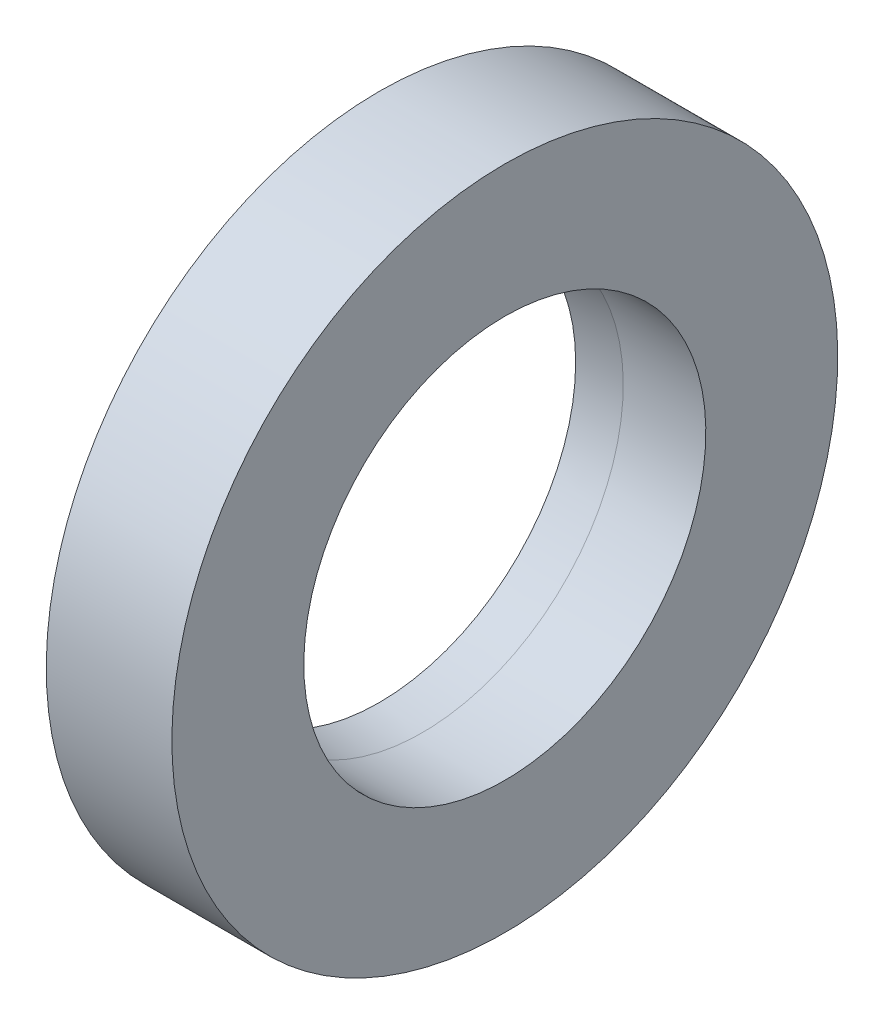
ISO-10303-21;
HEADER;
FILE_DESCRIPTION(('STEP AP214'),'2;1');
FILE_NAME('part.step','',(''),(''),'','','');
FILE_SCHEMA(('AUTOMOTIVE_DESIGN { 1 0 10303 214 1 1 1 1 }'));
ENDSEC;
DATA;
#1=APPLICATION_CONTEXT('core data for automotive mechanical design processes');
#2=APPLICATION_PROTOCOL_DEFINITION('international standard','automotive_design',2000,#1);
#3=PRODUCT_CONTEXT('',#1,'mechanical');
#4=PRODUCT('Part','Part','',(#3));
#5=PRODUCT_RELATED_PRODUCT_CATEGORY('part','',(#4));
#6=PRODUCT_DEFINITION_FORMATION('','',#4);
#7=PRODUCT_DEFINITION_CONTEXT('part definition',#1,'design');
#8=PRODUCT_DEFINITION('design','',#6,#7);
#9=PRODUCT_DEFINITION_SHAPE('','',#8);
#10=(LENGTH_UNIT() NAMED_UNIT(*) SI_UNIT(.MILLI.,.METRE.));
#11=(NAMED_UNIT(*) PLANE_ANGLE_UNIT() SI_UNIT($,.RADIAN.));
#12=(NAMED_UNIT(*) SI_UNIT($,.STERADIAN.) SOLID_ANGLE_UNIT());
#13=UNCERTAINTY_MEASURE_WITH_UNIT(LENGTH_MEASURE(1.E-05),#10,'distance_accuracy_value','');
#14=(GEOMETRIC_REPRESENTATION_CONTEXT(3) GLOBAL_UNCERTAINTY_ASSIGNED_CONTEXT((#13)) GLOBAL_UNIT_ASSIGNED_CONTEXT((#10,
#11,#12)) REPRESENTATION_CONTEXT('',''));
#15=CARTESIAN_POINT('',(0.,0.,0.));
#16=DIRECTION('',(0.,0.,1.));
#17=DIRECTION('',(1.,0.,0.));
#18=AXIS2_PLACEMENT_3D('',#15,#16,#17);
#19=CARTESIAN_POINT('',(17.7364104268147,24.7703748859759,0.));
#20=DIRECTION('',(-1.,0.,0.));
#21=DIRECTION('',(0.,-1.,0.));
#22=AXIS2_PLACEMENT_3D('',#19,#20,#21);
#23=PLANE('',#22);
#24=CARTESIAN_POINT('',(17.7364104268147,0.,0.));
#25=DIRECTION('',(1.,0.,0.));
#26=DIRECTION('',(0.,1.,0.));
#27=AXIS2_PLACEMENT_3D('',#24,#25,#26);
#28=CIRCLE('',#27,24.7703748859759);
#29=CARTESIAN_POINT('',(17.7364104268147,24.7703748859759,0.));
#30=VERTEX_POINT('',#29);
#31=EDGE_CURVE('E68',#30,#30,#28,.T.);
#32=ORIENTED_EDGE('',*,*,#31,.T.);
#33=EDGE_LOOP('',(#32));
#34=FACE_BOUND('',#33,.T.);
#35=CARTESIAN_POINT('',(17.7364104268147,0.,0.));
#36=DIRECTION('',(1.,0.,0.));
#37=DIRECTION('',(0.,1.,0.));
#38=AXIS2_PLACEMENT_3D('',#35,#36,#37);
#39=CIRCLE('',#38,26.5);
#40=CARTESIAN_POINT('',(17.7364104268147,26.5,0.));
#41=VERTEX_POINT('',#40);
#42=EDGE_CURVE('E10',#41,#41,#39,.T.);
#43=ORIENTED_EDGE('',*,*,#42,.F.);
#44=EDGE_LOOP('',(#43));
#45=FACE_BOUND('',#44,.T.);
#46=ADVANCED_FACE('F31',(#34,#45),#23,.T.);
#47=CARTESIAN_POINT('',(54.7364104268147,0.,0.));
#48=DIRECTION('',(1.,0.,0.));
#49=DIRECTION('',(0.,1.,0.));
#50=AXIS2_PLACEMENT_3D('',#47,#48,#49);
#51=CYLINDRICAL_SURFACE('',#50,26.5);
#52=ORIENTED_EDGE('',*,*,#42,.T.);
#53=EDGE_LOOP('',(#52));
#54=FACE_BOUND('',#53,.T.);
#55=CARTESIAN_POINT('',(27.7364104268147,0.,0.));
#56=DIRECTION('',(1.,0.,0.));
#57=DIRECTION('',(0.,1.,0.));
#58=AXIS2_PLACEMENT_3D('',#55,#56,#57);
#59=CIRCLE('',#58,26.5);
#60=CARTESIAN_POINT('',(27.7364104268147,26.5,0.));
#61=VERTEX_POINT('',#60);
#62=EDGE_CURVE('E37',#61,#61,#59,.T.);
#63=ORIENTED_EDGE('',*,*,#62,.F.);
#64=EDGE_LOOP('',(#63));
#65=FACE_BOUND('',#64,.T.);
#66=ADVANCED_FACE('F86',(#54,#65),#51,.T.);
#67=CARTESIAN_POINT('',(27.7364104268147,26.5,0.));
#68=DIRECTION('',(1.,0.,0.));
#69=DIRECTION('',(0.,1.,0.));
#70=AXIS2_PLACEMENT_3D('',#67,#68,#69);
#71=PLANE('',#70);
#72=ORIENTED_EDGE('',*,*,#62,.T.);
#73=EDGE_LOOP('',(#72));
#74=FACE_BOUND('',#73,.T.);
#75=CARTESIAN_POINT('',(27.7364104268147,0.,0.));
#76=DIRECTION('',(1.,0.,0.));
#77=DIRECTION('',(0.,1.,0.));
#78=AXIS2_PLACEMENT_3D('',#75,#76,#77);
#79=CIRCLE('',#78,16.);
#80=CARTESIAN_POINT('',(27.7364104268147,16.,0.));
#81=VERTEX_POINT('',#80);
#82=EDGE_CURVE('E41',#81,#81,#79,.T.);
#83=ORIENTED_EDGE('',*,*,#82,.F.);
#84=EDGE_LOOP('',(#83));
#85=FACE_BOUND('',#84,.T.);
#86=ADVANCED_FACE('F90',(#74,#85),#71,.T.);
#87=CARTESIAN_POINT('',(54.7364104268147,0.,0.));
#88=DIRECTION('',(1.,0.,0.));
#89=DIRECTION('',(0.,1.,0.));
#90=AXIS2_PLACEMENT_3D('',#87,#88,#89);
#91=CYLINDRICAL_SURFACE('',#90,16.);
#92=ORIENTED_EDGE('',*,*,#82,.T.);
#93=EDGE_LOOP('',(#92));
#94=FACE_BOUND('',#93,.T.);
#95=CARTESIAN_POINT('',(21.1639889777772,0.,0.));
#96=DIRECTION('',(1.,0.,0.));
#97=DIRECTION('',(0.,1.,0.));
#98=AXIS2_PLACEMENT_3D('',#95,#96,#97);
#99=CIRCLE('',#98,16.);
#100=CARTESIAN_POINT('',(21.1639889777772,16.,0.));
#101=VERTEX_POINT('',#100);
#102=EDGE_CURVE('E45',#101,#101,#99,.T.);
#103=ORIENTED_EDGE('',*,*,#102,.F.);
#104=EDGE_LOOP('',(#103));
#105=FACE_BOUND('',#104,.T.);
#106=ADVANCED_FACE('F94',(#94,#105),#91,.F.);
#107=CARTESIAN_POINT('',(17.7364104268147,0.,0.));
#108=DIRECTION('',(1.,0.,0.));
#109=DIRECTION('',(0.,1.,0.));
#110=AXIS2_PLACEMENT_3D('',#107,#108,#109);
#111=CONICAL_SURFACE('',#110,15.6393754424012,0.104826965376568);
#112=ORIENTED_EDGE('',*,*,#102,.T.);
#113=EDGE_LOOP('',(#112));
#114=FACE_BOUND('',#113,.T.);
#115=CARTESIAN_POINT('',(17.7364104268147,0.,0.));
#116=DIRECTION('',(1.,0.,0.));
#117=DIRECTION('',(0.,1.,0.));
#118=AXIS2_PLACEMENT_3D('',#115,#116,#117);
#119=CIRCLE('',#118,15.6393754424012);
#120=CARTESIAN_POINT('',(17.7364104268147,15.6393754424012,0.));
#121=VERTEX_POINT('',#120);
#122=EDGE_CURVE('E50',#121,#121,#119,.T.);
#123=ORIENTED_EDGE('',*,*,#122,.F.);
#124=EDGE_LOOP('',(#123));
#125=FACE_BOUND('',#124,.T.);
#126=ADVANCED_FACE('F100',(#114,#125),#111,.F.);
#127=CARTESIAN_POINT('',(17.7364104268147,15.6393754424012,0.));
#128=DIRECTION('',(-1.,0.,0.));
#129=DIRECTION('',(0.,-1.,0.));
#130=AXIS2_PLACEMENT_3D('',#127,#128,#129);
#131=PLANE('',#130);
#132=ORIENTED_EDGE('',*,*,#122,.T.);
#133=EDGE_LOOP('',(#132));
#134=FACE_BOUND('',#133,.T.);
#135=CARTESIAN_POINT('',(17.7364104268147,0.,0.));
#136=DIRECTION('',(1.,0.,0.));
#137=DIRECTION('',(0.,1.,0.));
#138=AXIS2_PLACEMENT_3D('',#135,#136,#137);
#139=CIRCLE('',#138,17.3108369693572);
#140=CARTESIAN_POINT('',(17.7364104268147,17.3108369693572,0.));
#141=VERTEX_POINT('',#140);
#142=EDGE_CURVE('E53',#141,#141,#139,.T.);
#143=ORIENTED_EDGE('',*,*,#142,.F.);
#144=EDGE_LOOP('',(#143));
#145=FACE_BOUND('',#144,.T.);
#146=ADVANCED_FACE('F104',(#134,#145),#131,.T.);
#147=CARTESIAN_POINT('',(21.9814029852584,0.,0.));
#148=DIRECTION('',(1.,0.,0.));
#149=DIRECTION('',(0.,1.,0.));
#150=AXIS2_PLACEMENT_3D('',#147,#148,#149);
#151=CONICAL_SURFACE('',#150,19.9863118096092,0.562377203469245);
#152=ORIENTED_EDGE('',*,*,#142,.T.);
#153=EDGE_LOOP('',(#152));
#154=FACE_BOUND('',#153,.T.);
#155=CARTESIAN_POINT('',(21.9814029852584,0.,0.));
#156=DIRECTION('',(1.,0.,0.));
#157=DIRECTION('',(0.,1.,0.));
#158=AXIS2_PLACEMENT_3D('',#155,#156,#157);
#159=CIRCLE('',#158,19.9863118096092);
#160=CARTESIAN_POINT('',(21.9814029852584,19.9863118096092,0.));
#161=VERTEX_POINT('',#160);
#162=EDGE_CURVE('E56',#161,#161,#159,.T.);
#163=ORIENTED_EDGE('',*,*,#162,.F.);
#164=EDGE_LOOP('',(#163));
#165=FACE_BOUND('',#164,.T.);
#166=ADVANCED_FACE('F108',(#154,#165),#151,.T.);
#167=CARTESIAN_POINT('',(21.1816047958759,0.,0.));
#168=DIRECTION('',(1.,0.,0.));
#169=DIRECTION('',(0.,1.,0.));
#170=AXIS2_PLACEMENT_3D('',#167,#168,#169);
#171=TOROIDAL_SURFACE('',#170,21.2552967804661,1.5);
#172=ORIENTED_EDGE('',*,*,#162,.T.);
#173=EDGE_LOOP('',(#172));
#174=FACE_BOUND('',#173,.T.);
#175=CARTESIAN_POINT('',(21.9861901338402,0.,0.));
#176=DIRECTION('',(1.,0.,0.));
#177=DIRECTION('',(0.,1.,0.));
#178=AXIS2_PLACEMENT_3D('',#175,#176,#177);
#179=CIRCLE('',#178,22.5212519273543);
#180=CARTESIAN_POINT('',(21.9861901338402,22.5212519273543,0.));
#181=VERTEX_POINT('',#180);
#182=EDGE_CURVE('E59',#181,#181,#179,.T.);
#183=ORIENTED_EDGE('',*,*,#182,.F.);
#184=EDGE_LOOP('',(#183));
#185=FACE_BOUND('',#184,.T.);
#186=ADVANCED_FACE('F112',(#174,#185),#171,.F.);
#187=CARTESIAN_POINT('',(19.4501997022959,0.,0.));
#188=DIRECTION('',(-1.,0.,0.));
#189=DIRECTION('',(0.,-1.,0.));
#190=AXIS2_PLACEMENT_3D('',#187,#188,#189);
#191=CONICAL_SURFACE('',#190,24.1330157591563,0.566154131261302);
#192=ORIENTED_EDGE('',*,*,#182,.T.);
#193=EDGE_LOOP('',(#192));
#194=FACE_BOUND('',#193,.T.);
#195=CARTESIAN_POINT('',(19.4501997022959,0.,0.));
#196=DIRECTION('',(1.,0.,0.));
#197=DIRECTION('',(0.,1.,0.));
#198=AXIS2_PLACEMENT_3D('',#195,#196,#197);
#199=CIRCLE('',#198,24.1330157591563);
#200=CARTESIAN_POINT('',(19.4501997022959,24.1330157591563,0.));
#201=VERTEX_POINT('',#200);
#202=EDGE_CURVE('E62',#201,#201,#199,.T.);
#203=ORIENTED_EDGE('',*,*,#202,.F.);
#204=EDGE_LOOP('',(#203));
#205=FACE_BOUND('',#204,.T.);
#206=ADVANCED_FACE('F82',(#194,#205),#191,.F.);
#207=CARTESIAN_POINT('',(19.4501997022959,24.1330157591563,0.));
#208=DIRECTION('',(-1.,0.,0.));
#209=DIRECTION('',(0.,-1.,0.));
#210=AXIS2_PLACEMENT_3D('',#207,#208,#209);
#211=PLANE('',#210);
#212=ORIENTED_EDGE('',*,*,#202,.T.);
#213=EDGE_LOOP('',(#212));
#214=FACE_BOUND('',#213,.T.);
#215=CARTESIAN_POINT('',(19.4501997022959,0.,0.));
#216=DIRECTION('',(1.,0.,0.));
#217=DIRECTION('',(0.,1.,0.));
#218=AXIS2_PLACEMENT_3D('',#215,#216,#217);
#219=CIRCLE('',#218,24.7703748859759);
#220=CARTESIAN_POINT('',(19.4501997022959,24.7703748859759,0.));
#221=VERTEX_POINT('',#220);
#222=EDGE_CURVE('E65',#221,#221,#219,.T.);
#223=ORIENTED_EDGE('',*,*,#222,.F.);
#224=EDGE_LOOP('',(#223));
#225=FACE_BOUND('',#224,.T.);
#226=ADVANCED_FACE('F76',(#214,#225),#211,.T.);
#227=CARTESIAN_POINT('',(54.7364104268147,0.,0.));
#228=DIRECTION('',(1.,0.,0.));
#229=DIRECTION('',(0.,1.,0.));
#230=AXIS2_PLACEMENT_3D('',#227,#228,#229);
#231=CYLINDRICAL_SURFACE('',#230,24.7703748859759);
#232=ORIENTED_EDGE('',*,*,#222,.T.);
#233=EDGE_LOOP('',(#232));
#234=FACE_BOUND('',#233,.T.);
#235=ORIENTED_EDGE('',*,*,#31,.F.);
#236=EDGE_LOOP('',(#235));
#237=FACE_BOUND('',#236,.T.);
#238=ADVANCED_FACE('F74',(#234,#237),#231,.F.);
#239=CLOSED_SHELL('',(#46,#66,#86,#106,#126,#146,#166,#186,#206,#226,#238));
#240=MANIFOLD_SOLID_BREP('B2',#239);
#241=ADVANCED_BREP_SHAPE_REPRESENTATION('',(#18,#240),#14);
#242=SHAPE_DEFINITION_REPRESENTATION(#9,#241);
ENDSEC;
END-ISO-10303-21;
